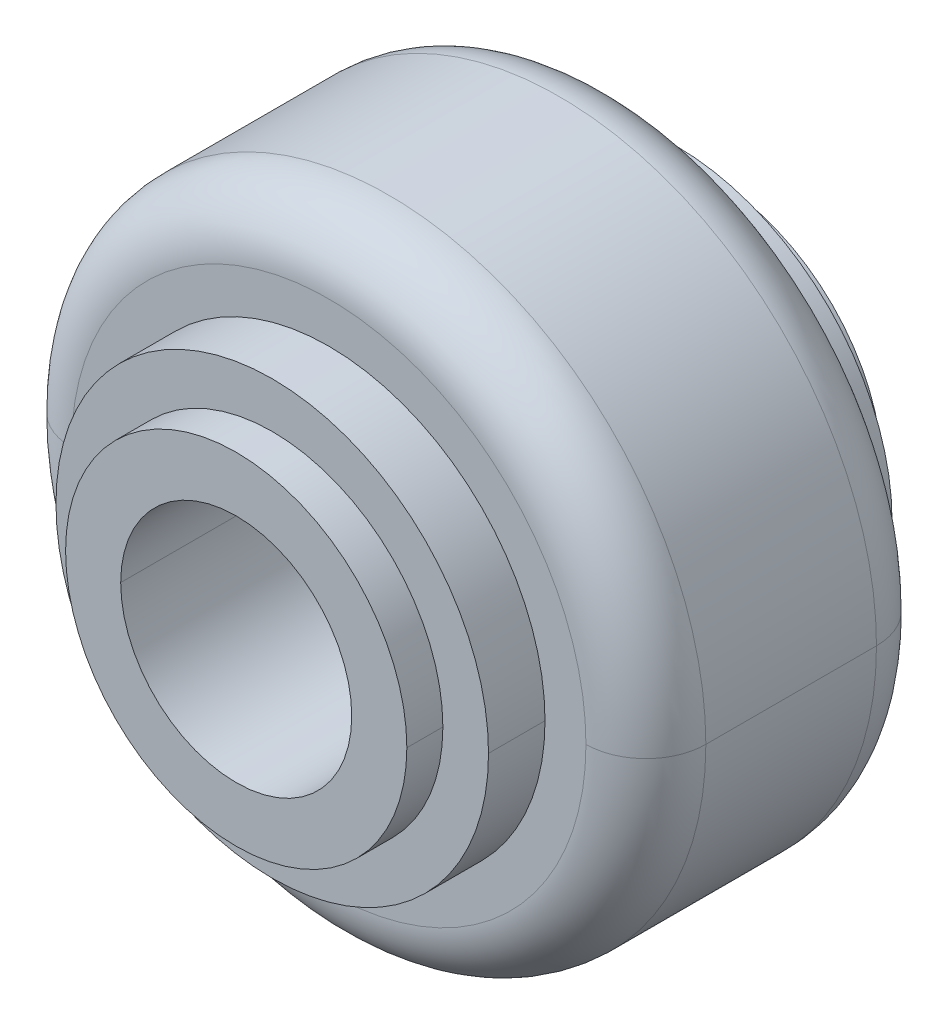
ISO-10303-21;
HEADER;
FILE_DESCRIPTION(('STEP AP214'),'2;1');
FILE_NAME('part.step','',(''),(''),'','','');
FILE_SCHEMA(('AUTOMOTIVE_DESIGN { 1 0 10303 214 1 1 1 1 }'));
ENDSEC;
DATA;
#1=APPLICATION_CONTEXT('core data for automotive mechanical design processes');
#2=APPLICATION_PROTOCOL_DEFINITION('international standard','automotive_design',2000,#1);
#3=PRODUCT_CONTEXT('',#1,'mechanical');
#4=PRODUCT('Part','Part','',(#3));
#5=PRODUCT_RELATED_PRODUCT_CATEGORY('part','',(#4));
#6=PRODUCT_DEFINITION_FORMATION('','',#4);
#7=PRODUCT_DEFINITION_CONTEXT('part definition',#1,'design');
#8=PRODUCT_DEFINITION('design','',#6,#7);
#9=PRODUCT_DEFINITION_SHAPE('','',#8);
#10=(LENGTH_UNIT() NAMED_UNIT(*) SI_UNIT(.MILLI.,.METRE.));
#11=(NAMED_UNIT(*) PLANE_ANGLE_UNIT() SI_UNIT($,.RADIAN.));
#12=(NAMED_UNIT(*) SI_UNIT($,.STERADIAN.) SOLID_ANGLE_UNIT());
#13=UNCERTAINTY_MEASURE_WITH_UNIT(LENGTH_MEASURE(1.E-05),#10,'distance_accuracy_value','');
#14=(GEOMETRIC_REPRESENTATION_CONTEXT(3) GLOBAL_UNCERTAINTY_ASSIGNED_CONTEXT((#13)) GLOBAL_UNIT_ASSIGNED_CONTEXT((#10,
#11,#12)) REPRESENTATION_CONTEXT('',''));
#15=CARTESIAN_POINT('',(0.,0.,0.));
#16=DIRECTION('',(0.,0.,1.));
#17=DIRECTION('',(1.,0.,0.));
#18=AXIS2_PLACEMENT_3D('',#15,#16,#17);
#19=CARTESIAN_POINT('',(0.,9.398,-13.096875));
#20=DIRECTION('',(0.,0.,1.));
#21=DIRECTION('',(1.,0.,0.));
#22=AXIS2_PLACEMENT_3D('',#19,#20,#21);
#23=PLANE('',#22);
#24=CARTESIAN_POINT('',(0.,0.,-13.096875));
#25=DIRECTION('',(0.,0.,-1.));
#26=DIRECTION('',(-1.,0.,0.));
#27=AXIS2_PLACEMENT_3D('',#24,#25,#26);
#28=CIRCLE('',#27,6.3627);
#29=CARTESIAN_POINT('',(-6.3627,0.,-13.096875));
#30=VERTEX_POINT('',#29);
#31=CARTESIAN_POINT('',(6.3627,0.,-13.096875));
#32=VERTEX_POINT('',#31);
#33=EDGE_CURVE('E11',#30,#32,#28,.T.);
#34=ORIENTED_EDGE('',*,*,#33,.F.);
#35=CARTESIAN_POINT('',(0.,0.,-13.096875));
#36=DIRECTION('',(0.,0.,-1.));
#37=DIRECTION('',(-1.,0.,0.));
#38=AXIS2_PLACEMENT_3D('',#35,#36,#37);
#39=CIRCLE('',#38,6.3627);
#40=EDGE_CURVE('E25',#32,#30,#39,.T.);
#41=ORIENTED_EDGE('',*,*,#40,.F.);
#42=EDGE_LOOP('',(#34,#41));
#43=FACE_BOUND('',#42,.T.);
#44=CARTESIAN_POINT('',(0.,0.,-13.096875));
#45=DIRECTION('',(0.,0.,-1.));
#46=DIRECTION('',(-1.,0.,0.));
#47=AXIS2_PLACEMENT_3D('',#44,#45,#46);
#48=CIRCLE('',#47,9.398);
#49=CARTESIAN_POINT('',(-9.398,0.,-13.096875));
#50=VERTEX_POINT('',#49);
#51=CARTESIAN_POINT('',(9.398,0.,-13.096875));
#52=VERTEX_POINT('',#51);
#53=EDGE_CURVE('E390',#50,#52,#48,.T.);
#54=ORIENTED_EDGE('',*,*,#53,.T.);
#55=CARTESIAN_POINT('',(0.,0.,-13.096875));
#56=DIRECTION('',(0.,0.,-1.));
#57=DIRECTION('',(-1.,0.,0.));
#58=AXIS2_PLACEMENT_3D('',#55,#56,#57);
#59=CIRCLE('',#58,9.398);
#60=EDGE_CURVE('E386',#52,#50,#59,.T.);
#61=ORIENTED_EDGE('',*,*,#60,.T.);
#62=EDGE_LOOP('',(#54,#61));
#63=FACE_BOUND('',#62,.T.);
#64=ADVANCED_FACE('F17',(#43,#63),#23,.F.);
#65=CARTESIAN_POINT('',(0.,0.,-13.096875));
#66=DIRECTION('',(0.,0.,1.));
#67=DIRECTION('',(0.,1.,0.));
#68=AXIS2_PLACEMENT_3D('',#65,#66,#67);
#69=CYLINDRICAL_SURFACE('',#68,9.398);
#70=CARTESIAN_POINT('',(0.,0.,-11.1125));
#71=DIRECTION('',(0.,0.,-1.));
#72=DIRECTION('',(-1.,0.,0.));
#73=AXIS2_PLACEMENT_3D('',#70,#71,#72);
#74=CIRCLE('',#73,9.398);
#75=CARTESIAN_POINT('',(9.398,0.,-11.1125));
#76=VERTEX_POINT('',#75);
#77=CARTESIAN_POINT('',(-9.398,0.,-11.1125));
#78=VERTEX_POINT('',#77);
#79=EDGE_CURVE('E382',#76,#78,#74,.T.);
#80=ORIENTED_EDGE('',*,*,#79,.T.);
#81=DIRECTION('',(0.,0.,1.));
#82=VECTOR('',#81,1.);
#83=CARTESIAN_POINT('',(-9.398,0.,-13.096875));
#84=LINE('',#83,#82);
#85=EDGE_CURVE('E377',#50,#78,#84,.T.);
#86=ORIENTED_EDGE('',*,*,#85,.F.);
#87=ORIENTED_EDGE('',*,*,#60,.F.);
#88=DIRECTION('',(0.,0.,1.));
#89=VECTOR('',#88,1.);
#90=CARTESIAN_POINT('',(9.398,0.,-13.096875));
#91=LINE('',#90,#89);
#92=EDGE_CURVE('E373',#52,#76,#91,.T.);
#93=ORIENTED_EDGE('',*,*,#92,.T.);
#94=EDGE_LOOP('',(#80,#86,#87,#93));
#95=FACE_BOUND('',#94,.T.);
#96=ADVANCED_FACE('F405',(#95),#69,.T.);
#97=CARTESIAN_POINT('',(0.,0.,-13.096875));
#98=DIRECTION('',(0.,0.,1.));
#99=DIRECTION('',(0.,-1.,0.));
#100=AXIS2_PLACEMENT_3D('',#97,#98,#99);
#101=CYLINDRICAL_SURFACE('',#100,9.398);
#102=ORIENTED_EDGE('',*,*,#53,.F.);
#103=ORIENTED_EDGE('',*,*,#85,.T.);
#104=CARTESIAN_POINT('',(0.,0.,-11.1125));
#105=DIRECTION('',(0.,0.,-1.));
#106=DIRECTION('',(-1.,0.,0.));
#107=AXIS2_PLACEMENT_3D('',#104,#105,#106);
#108=CIRCLE('',#107,9.398);
#109=EDGE_CURVE('E368',#78,#76,#108,.T.);
#110=ORIENTED_EDGE('',*,*,#109,.T.);
#111=ORIENTED_EDGE('',*,*,#92,.F.);
#112=EDGE_LOOP('',(#102,#103,#110,#111));
#113=FACE_BOUND('',#112,.T.);
#114=ADVANCED_FACE('F406',(#113),#101,.T.);
#115=CARTESIAN_POINT('',(0.,11.9126,-11.1125));
#116=DIRECTION('',(0.,0.,1.));
#117=DIRECTION('',(1.,0.,0.));
#118=AXIS2_PLACEMENT_3D('',#115,#116,#117);
#119=PLANE('',#118);
#120=ORIENTED_EDGE('',*,*,#109,.F.);
#121=ORIENTED_EDGE('',*,*,#79,.F.);
#122=EDGE_LOOP('',(#120,#121));
#123=FACE_BOUND('',#122,.T.);
#124=CARTESIAN_POINT('',(0.,0.,-11.1125));
#125=DIRECTION('',(0.,0.,-1.));
#126=DIRECTION('',(-1.,0.,0.));
#127=AXIS2_PLACEMENT_3D('',#124,#125,#126);
#128=CIRCLE('',#127,11.9126);
#129=CARTESIAN_POINT('',(-11.9126,0.,-11.1125));
#130=VERTEX_POINT('',#129);
#131=CARTESIAN_POINT('',(11.9126,0.,-11.1125));
#132=VERTEX_POINT('',#131);
#133=EDGE_CURVE('E364',#130,#132,#128,.T.);
#134=ORIENTED_EDGE('',*,*,#133,.T.);
#135=CARTESIAN_POINT('',(0.,0.,-11.1125));
#136=DIRECTION('',(0.,0.,-1.));
#137=DIRECTION('',(-1.,0.,0.));
#138=AXIS2_PLACEMENT_3D('',#135,#136,#137);
#139=CIRCLE('',#138,11.9126);
#140=EDGE_CURVE('E360',#132,#130,#139,.T.);
#141=ORIENTED_EDGE('',*,*,#140,.T.);
#142=EDGE_LOOP('',(#134,#141));
#143=FACE_BOUND('',#142,.T.);
#144=ADVANCED_FACE('F410',(#123,#143),#119,.F.);
#145=CARTESIAN_POINT('',(0.,0.,-13.096875));
#146=DIRECTION('',(0.,0.,1.));
#147=DIRECTION('',(0.,1.,0.));
#148=AXIS2_PLACEMENT_3D('',#145,#146,#147);
#149=CYLINDRICAL_SURFACE('',#148,11.9126);
#150=CARTESIAN_POINT('',(0.,0.,-8.001));
#151=DIRECTION('',(0.,0.,-1.));
#152=DIRECTION('',(-1.,0.,0.));
#153=AXIS2_PLACEMENT_3D('',#150,#151,#152);
#154=CIRCLE('',#153,11.9126);
#155=CARTESIAN_POINT('',(11.9126,0.,-8.001));
#156=VERTEX_POINT('',#155);
#157=CARTESIAN_POINT('',(-11.9126,0.,-8.001));
#158=VERTEX_POINT('',#157);
#159=EDGE_CURVE('E356',#156,#158,#154,.T.);
#160=ORIENTED_EDGE('',*,*,#159,.T.);
#161=DIRECTION('',(0.,0.,1.));
#162=VECTOR('',#161,1.);
#163=CARTESIAN_POINT('',(-11.9126,0.,-11.1125));
#164=LINE('',#163,#162);
#165=EDGE_CURVE('E351',#130,#158,#164,.T.);
#166=ORIENTED_EDGE('',*,*,#165,.F.);
#167=ORIENTED_EDGE('',*,*,#140,.F.);
#168=DIRECTION('',(0.,0.,1.));
#169=VECTOR('',#168,1.);
#170=CARTESIAN_POINT('',(11.9126,0.,-11.1125));
#171=LINE('',#170,#169);
#172=EDGE_CURVE('E347',#132,#156,#171,.T.);
#173=ORIENTED_EDGE('',*,*,#172,.T.);
#174=EDGE_LOOP('',(#160,#166,#167,#173));
#175=FACE_BOUND('',#174,.T.);
#176=ADVANCED_FACE('F413',(#175),#149,.T.);
#177=CARTESIAN_POINT('',(0.,0.,-13.096875));
#178=DIRECTION('',(0.,0.,1.));
#179=DIRECTION('',(0.,-1.,0.));
#180=AXIS2_PLACEMENT_3D('',#177,#178,#179);
#181=CYLINDRICAL_SURFACE('',#180,11.9126);
#182=ORIENTED_EDGE('',*,*,#133,.F.);
#183=ORIENTED_EDGE('',*,*,#165,.T.);
#184=CARTESIAN_POINT('',(0.,0.,-8.001));
#185=DIRECTION('',(0.,0.,-1.));
#186=DIRECTION('',(-1.,0.,0.));
#187=AXIS2_PLACEMENT_3D('',#184,#185,#186);
#188=CIRCLE('',#187,11.9126);
#189=EDGE_CURVE('E342',#158,#156,#188,.T.);
#190=ORIENTED_EDGE('',*,*,#189,.T.);
#191=ORIENTED_EDGE('',*,*,#172,.F.);
#192=EDGE_LOOP('',(#182,#183,#190,#191));
#193=FACE_BOUND('',#192,.T.);
#194=ADVANCED_FACE('F421',(#193),#181,.T.);
#195=CARTESIAN_POINT('',(0.,14.16685,-8.001));
#196=DIRECTION('',(0.,0.,1.));
#197=DIRECTION('',(1.,0.,0.));
#198=AXIS2_PLACEMENT_3D('',#195,#196,#197);
#199=PLANE('',#198);
#200=ORIENTED_EDGE('',*,*,#189,.F.);
#201=ORIENTED_EDGE('',*,*,#159,.F.);
#202=EDGE_LOOP('',(#200,#201));
#203=FACE_BOUND('',#202,.T.);
#204=CARTESIAN_POINT('',(0.,0.,-8.001));
#205=DIRECTION('',(0.,0.,-1.));
#206=DIRECTION('',(-1.,0.,0.));
#207=AXIS2_PLACEMENT_3D('',#204,#205,#206);
#208=CIRCLE('',#207,14.16685);
#209=CARTESIAN_POINT('',(-14.16685,0.,-8.001));
#210=VERTEX_POINT('',#209);
#211=CARTESIAN_POINT('',(14.16685,0.,-8.00100000000008));
#212=VERTEX_POINT('',#211);
#213=EDGE_CURVE('E338',#210,#212,#208,.T.);
#214=ORIENTED_EDGE('',*,*,#213,.T.);
#215=CARTESIAN_POINT('',(0.,0.,-8.001));
#216=DIRECTION('',(0.,0.,-1.));
#217=DIRECTION('',(-1.,0.,0.));
#218=AXIS2_PLACEMENT_3D('',#215,#216,#217);
#219=CIRCLE('',#218,14.16685);
#220=EDGE_CURVE('E334',#212,#210,#219,.T.);
#221=ORIENTED_EDGE('',*,*,#220,.T.);
#222=EDGE_LOOP('',(#214,#221));
#223=FACE_BOUND('',#222,.T.);
#224=ADVANCED_FACE('F425',(#203,#223),#199,.F.);
#225=CARTESIAN_POINT('',(0.,0.,-4.69900000000008));
#226=DIRECTION('',(0.,0.,-1.));
#227=DIRECTION('',(0.,1.,0.));
#228=AXIS2_PLACEMENT_3D('',#225,#226,#227);
#229=TOROIDAL_SURFACE('',#228,14.16685,3.302);
#230=CARTESIAN_POINT('',(0.,0.,-4.699));
#231=DIRECTION('',(0.,0.,-1.));
#232=DIRECTION('',(-1.,0.,0.));
#233=AXIS2_PLACEMENT_3D('',#230,#231,#232);
#234=CIRCLE('',#233,17.46885);
#235=CARTESIAN_POINT('',(17.46885,0.,-4.69900000000008));
#236=VERTEX_POINT('',#235);
#237=CARTESIAN_POINT('',(-17.46885,0.,-4.699));
#238=VERTEX_POINT('',#237);
#239=EDGE_CURVE('E332',#236,#238,#234,.T.);
#240=ORIENTED_EDGE('',*,*,#239,.T.);
#241=CARTESIAN_POINT('',(-17.46885,0.,-4.69900000000008));
#242=CARTESIAN_POINT('',(-17.4688511460871,0.,-4.75302890321754));
#243=CARTESIAN_POINT('',(-17.4675239733473,0.,-4.80705770891421));
#244=CARTESIAN_POINT('',(-17.4622212194317,0.,-4.91498521234421));
#245=CARTESIAN_POINT('',(-17.458245638256,0.,-4.96888391007753));
#246=CARTESIAN_POINT('',(-17.4476542966872,0.,-5.07642128465904));
#247=CARTESIAN_POINT('',(-17.4410385362939,0.,-5.13005996150722));
#248=CARTESIAN_POINT('',(-17.4251831355135,0.,-5.23694809179614));
#249=CARTESIAN_POINT('',(-17.4159434951262,0.,-5.29019754523688));
#250=CARTESIAN_POINT('',(-17.3948624966567,0.,-5.39617894135779));
#251=CARTESIAN_POINT('',(-17.3830211385745,0.,-5.44891088403796));
#252=CARTESIAN_POINT('',(-17.3567652575223,0.,-5.55373022404334));
#253=CARTESIAN_POINT('',(-17.3423507345524,0.,-5.60581762136855));
#254=CARTESIAN_POINT('',(-17.3109832426231,0.,-5.70922238722007));
#255=CARTESIAN_POINT('',(-17.2940302736637,0.,-5.76053975574639));
#256=CARTESIAN_POINT('',(-17.2576267328049,0.,-5.86228083605598));
#257=CARTESIAN_POINT('',(-17.2381761609055,0.,-5.91270454783925));
#258=CARTESIAN_POINT('',(-17.196824271799,0.,-6.01253683949995));
#259=CARTESIAN_POINT('',(-17.1749229545919,0.,-6.06194541937738));
#260=CARTESIAN_POINT('',(-17.1287223371953,0.,-6.15962841763635));
#261=CARTESIAN_POINT('',(-17.1044230370057,0.,-6.2079028360179));
#262=CARTESIAN_POINT('',(-17.0534849927508,0.,-6.30320121398114));
#263=CARTESIAN_POINT('',(-17.0268462486855,0.,-6.35022517356282));
#264=CARTESIAN_POINT('',(-16.9712934917563,0.,-6.44290934908936));
#265=CARTESIAN_POINT('',(-16.9423794788925,0.,-6.48856956503422));
#266=CARTESIAN_POINT('',(-16.8823458407535,0.,-6.57841625382739));
#267=CARTESIAN_POINT('',(-16.8512262154782,0.,-6.62260272667571));
#268=CARTESIAN_POINT('',(-16.78685632242,0.,-6.70939548019247));
#269=CARTESIAN_POINT('',(-16.753606054637,0.,-6.75200176086092));
#270=CARTESIAN_POINT('',(-16.6850549793705,0.,-6.83553148775594));
#271=CARTESIAN_POINT('',(-16.6497541718871,0.,-6.87645493398251));
#272=CARTESIAN_POINT('',(-16.577187059957,0.,-6.95652040382735));
#273=CARTESIAN_POINT('',(-16.5399207555104,0.,-6.99566242744561));
#274=CARTESIAN_POINT('',(-16.4635124274455,0.,-7.0720707555105));
#275=CARTESIAN_POINT('',(-16.4243704038273,0.,-7.10933705995712));
#276=CARTESIAN_POINT('',(-16.3443049339824,0.,-7.18190417188718));
#277=CARTESIAN_POINT('',(-16.3033814877559,0.,-7.21720497937062));
#278=CARTESIAN_POINT('',(-16.2198517608609,0.,-7.28575605463705));
#279=CARTESIAN_POINT('',(-16.1772454801924,0.,-7.31900632242004));
#280=CARTESIAN_POINT('',(-16.0904527266756,0.,-7.38337621547829));
#281=CARTESIAN_POINT('',(-16.0462662538273,0.,-7.41449584075355));
#282=CARTESIAN_POINT('',(-15.9564195650341,0.,-7.47452947889261));
#283=CARTESIAN_POINT('',(-15.9107593490893,0.,-7.5034434917564));
#284=CARTESIAN_POINT('',(-15.8180751735628,0.,-7.55899624868554));
#285=CARTESIAN_POINT('',(-15.7710512139811,0.,-7.58563499275089));
#286=CARTESIAN_POINT('',(-15.6757528360178,0.,-7.6365730370058));
#287=CARTESIAN_POINT('',(-15.6274784176363,0.,-7.66087233719536));
#288=CARTESIAN_POINT('',(-15.5297954193773,0.,-7.70707295459201));
#289=CARTESIAN_POINT('',(-15.4803868394999,0.,-7.72897427179909));
#290=CARTESIAN_POINT('',(-15.3805545478392,0.,-7.77032616090559));
#291=CARTESIAN_POINT('',(-15.3301308360559,0.,-7.78977673280501));
#292=CARTESIAN_POINT('',(-15.2283897557463,0.,-7.82618027366381));
#293=CARTESIAN_POINT('',(-15.17707238722,0.,-7.84313324262319));
#294=CARTESIAN_POINT('',(-15.0736676213685,0.,-7.87450073455247));
#295=CARTESIAN_POINT('',(-15.0215802240433,0.,-7.88891525752238));
#296=CARTESIAN_POINT('',(-14.9167608840379,0.,-7.91517113857454));
#297=CARTESIAN_POINT('',(-14.8640289413577,0.,-7.92701249665679));
#298=CARTESIAN_POINT('',(-14.7580475452368,0.,-7.9480934951263));
#299=CARTESIAN_POINT('',(-14.7047980917961,0.,-7.95733313551355));
#300=CARTESIAN_POINT('',(-14.5979099615071,0.,-7.97318853629401));
#301=CARTESIAN_POINT('',(-14.544271284659,0.,-7.97980429668723));
#302=CARTESIAN_POINT('',(-14.4367339100775,0.,-7.99039563825611));
#303=CARTESIAN_POINT('',(-14.3828352123441,0.,-7.99437121943178));
#304=CARTESIAN_POINT('',(-14.2749077089141,0.,-7.99967397334733));
#305=CARTESIAN_POINT('',(-14.2208789032175,0.,-8.00100114608721));
#306=CARTESIAN_POINT('',(-14.16685,0.,-8.00100000000008));
#307=B_SPLINE_CURVE_WITH_KNOTS('',3,(#241,#242,#243,#244,#245,#246,#247,#248,#249,#250,#251,
#252,#253,#254,#255,#256,#257,#258,#259,#260,#261,#262,#263,#264,#265,#266,#267,#268,#269,#270,
#271,#272,#273,#274,#275,#276,#277,#278,#279,#280,#281,#282,#283,#284,#285,#286,#287,#288,#289,
#290,#291,#292,#293,#294,#295,#296,#297,#298,#299,#300,#301,#302,#303,#304,#305,#306),
.UNSPECIFIED.,.F.,.F.,(4,2,2,2,2,2,2,2,2,2,2,2,2,2,2,2,2,2,2,2,2,2,2,2,2,2,2,2,2,2,2,2,4),(0.,
0.162070273165312,0.324140546330625,0.486210819495938,0.64828109266125,0.810351365826563,
0.972421638991876,1.13449191215719,1.2965621853225,1.45863245848781,1.62070273165313,
1.78277300481844,1.94484327798375,2.10691355114906,2.26898382431438,2.43105409747969,
2.593124370645,2.75519464381031,2.91726491697563,3.07933519014094,3.24140546330625,
3.40347573647156,3.56554600963688,3.72761628280219,3.8896865559675,4.05175682913281,
4.21382710229813,4.37589737546344,4.53796764862875,4.70003792179406,4.86210819495938,
5.02417846812469,5.18624874129),.UNSPECIFIED.);
#308=EDGE_CURVE('E309',#238,#210,#307,.T.);
#309=ORIENTED_EDGE('',*,*,#308,.T.);
#310=ORIENTED_EDGE('',*,*,#220,.F.);
#311=CARTESIAN_POINT('',(17.46885,0.,-4.69900000000008));
#312=CARTESIAN_POINT('',(17.4688511460871,0.,-4.75302890321754));
#313=CARTESIAN_POINT('',(17.4675239733473,0.,-4.80705770891421));
#314=CARTESIAN_POINT('',(17.4622212194317,0.,-4.91498521234421));
#315=CARTESIAN_POINT('',(17.458245638256,0.,-4.96888391007754));
#316=CARTESIAN_POINT('',(17.4476542966872,0.,-5.07642128465904));
#317=CARTESIAN_POINT('',(17.4410385362939,0.,-5.13005996150722));
#318=CARTESIAN_POINT('',(17.4251831355135,0.,-5.23694809179614));
#319=CARTESIAN_POINT('',(17.4159434951262,0.,-5.29019754523688));
#320=CARTESIAN_POINT('',(17.3948624966567,0.,-5.39617894135779));
#321=CARTESIAN_POINT('',(17.3830211385745,0.,-5.44891088403797));
#322=CARTESIAN_POINT('',(17.3567652575223,0.,-5.55373022404335));
#323=CARTESIAN_POINT('',(17.3423507345524,0.,-5.60581762136855));
#324=CARTESIAN_POINT('',(17.3109832426231,0.,-5.70922238722008));
#325=CARTESIAN_POINT('',(17.2940302736637,0.,-5.76053975574639));
#326=CARTESIAN_POINT('',(17.2576267328049,0.,-5.86228083605598));
#327=CARTESIAN_POINT('',(17.2381761609055,0.,-5.91270454783926));
#328=CARTESIAN_POINT('',(17.196824271799,0.,-6.01253683949995));
#329=CARTESIAN_POINT('',(17.1749229545919,0.,-6.06194541937738));
#330=CARTESIAN_POINT('',(17.1287223371953,0.,-6.15962841763636));
#331=CARTESIAN_POINT('',(17.1044230370057,0.,-6.2079028360179));
#332=CARTESIAN_POINT('',(17.0534849927508,0.,-6.30320121398114));
#333=CARTESIAN_POINT('',(17.0268462486855,0.,-6.35022517356283));
#334=CARTESIAN_POINT('',(16.9712934917563,0.,-6.44290934908937));
#335=CARTESIAN_POINT('',(16.9423794788925,0.,-6.48856956503422));
#336=CARTESIAN_POINT('',(16.8823458407535,0.,-6.57841625382739));
#337=CARTESIAN_POINT('',(16.8512262154782,0.,-6.62260272667571));
#338=CARTESIAN_POINT('',(16.78685632242,0.,-6.70939548019248));
#339=CARTESIAN_POINT('',(16.753606054637,0.,-6.75200176086093));
#340=CARTESIAN_POINT('',(16.6850549793705,0.,-6.83553148775594));
#341=CARTESIAN_POINT('',(16.6497541718871,0.,-6.87645493398251));
#342=CARTESIAN_POINT('',(16.577187059957,0.,-6.95652040382735));
#343=CARTESIAN_POINT('',(16.5399207555104,0.,-6.99566242744561));
#344=CARTESIAN_POINT('',(16.4635124274455,0.,-7.0720707555105));
#345=CARTESIAN_POINT('',(16.4243704038273,0.,-7.10933705995712));
#346=CARTESIAN_POINT('',(16.3443049339824,0.,-7.18190417188718));
#347=CARTESIAN_POINT('',(16.3033814877559,0.,-7.21720497937062));
#348=CARTESIAN_POINT('',(16.2198517608608,0.,-7.28575605463705));
#349=CARTESIAN_POINT('',(16.1772454801924,0.,-7.31900632242004));
#350=CARTESIAN_POINT('',(16.0904527266756,0.,-7.38337621547829));
#351=CARTESIAN_POINT('',(16.0462662538273,0.,-7.41449584075355));
#352=CARTESIAN_POINT('',(15.9564195650341,0.,-7.47452947889261));
#353=CARTESIAN_POINT('',(15.9107593490893,0.,-7.5034434917564));
#354=CARTESIAN_POINT('',(15.8180751735627,0.,-7.55899624868554));
#355=CARTESIAN_POINT('',(15.7710512139811,0.,-7.58563499275089));
#356=CARTESIAN_POINT('',(15.6757528360178,0.,-7.6365730370058));
#357=CARTESIAN_POINT('',(15.6274784176363,0.,-7.66087233719536));
#358=CARTESIAN_POINT('',(15.5297954193773,0.,-7.70707295459201));
#359=CARTESIAN_POINT('',(15.4803868394999,0.,-7.72897427179909));
#360=CARTESIAN_POINT('',(15.3805545478392,0.,-7.7703261609056));
#361=CARTESIAN_POINT('',(15.3301308360559,0.,-7.78977673280501));
#362=CARTESIAN_POINT('',(15.2283897557463,0.,-7.82618027366381));
#363=CARTESIAN_POINT('',(15.17707238722,0.,-7.84313324262319));
#364=CARTESIAN_POINT('',(15.0736676213685,0.,-7.87450073455247));
#365=CARTESIAN_POINT('',(15.0215802240433,0.,-7.88891525752238));
#366=CARTESIAN_POINT('',(14.9167608840379,0.,-7.91517113857454));
#367=CARTESIAN_POINT('',(14.8640289413577,0.,-7.92701249665679));
#368=CARTESIAN_POINT('',(14.7580475452368,0.,-7.9480934951263));
#369=CARTESIAN_POINT('',(14.7047980917961,0.,-7.95733313551355));
#370=CARTESIAN_POINT('',(14.5979099615071,0.,-7.97318853629402));
#371=CARTESIAN_POINT('',(14.544271284659,0.,-7.97980429668723));
#372=CARTESIAN_POINT('',(14.4367339100775,0.,-7.99039563825611));
#373=CARTESIAN_POINT('',(14.3828352123441,0.,-7.99437121943178));
#374=CARTESIAN_POINT('',(14.2749077089141,0.,-7.99967397334733));
#375=CARTESIAN_POINT('',(14.2208789032175,0.,-8.00100114608721));
#376=CARTESIAN_POINT('',(14.16685,0.,-8.00100000000008));
#377=B_SPLINE_CURVE_WITH_KNOTS('',3,(#311,#312,#313,#314,#315,#316,#317,#318,#319,#320,#321,
#322,#323,#324,#325,#326,#327,#328,#329,#330,#331,#332,#333,#334,#335,#336,#337,#338,#339,#340,
#341,#342,#343,#344,#345,#346,#347,#348,#349,#350,#351,#352,#353,#354,#355,#356,#357,#358,#359,
#360,#361,#362,#363,#364,#365,#366,#367,#368,#369,#370,#371,#372,#373,#374,#375,#376),
.UNSPECIFIED.,.F.,.F.,(4,2,2,2,2,2,2,2,2,2,2,2,2,2,2,2,2,2,2,2,2,2,2,2,2,2,2,2,2,2,2,2,4),(0.,
0.162070273165313,0.324140546330626,0.486210819495938,0.64828109266125,0.810351365826564,
0.972421638991876,1.13449191215719,1.2965621853225,1.45863245848781,1.62070273165313,
1.78277300481844,1.94484327798375,2.10691355114906,2.26898382431438,2.43105409747969,
2.593124370645,2.75519464381031,2.91726491697563,3.07933519014094,3.24140546330625,
3.40347573647156,3.56554600963688,3.72761628280219,3.8896865559675,4.05175682913282,
4.21382710229813,4.37589737546344,4.53796764862875,4.70003792179407,4.86210819495938,
5.02417846812469,5.18624874129),.UNSPECIFIED.);
#378=EDGE_CURVE('E322',#236,#212,#377,.T.);
#379=ORIENTED_EDGE('',*,*,#378,.F.);
#380=EDGE_LOOP('',(#240,#309,#310,#379));
#381=FACE_BOUND('',#380,.T.);
#382=ADVANCED_FACE('F288',(#381),#229,.T.);
#383=CARTESIAN_POINT('',(0.,0.,-4.69900000000008));
#384=DIRECTION('',(0.,0.,-1.));
#385=DIRECTION('',(0.,-1.,0.));
#386=AXIS2_PLACEMENT_3D('',#383,#384,#385);
#387=TOROIDAL_SURFACE('',#386,14.16685,3.302);
#388=ORIENTED_EDGE('',*,*,#213,.F.);
#389=ORIENTED_EDGE('',*,*,#308,.F.);
#390=CARTESIAN_POINT('',(0.,0.,-4.699));
#391=DIRECTION('',(0.,0.,-1.));
#392=DIRECTION('',(-1.,0.,0.));
#393=AXIS2_PLACEMENT_3D('',#390,#391,#392);
#394=CIRCLE('',#393,17.46885);
#395=EDGE_CURVE('E268',#238,#236,#394,.T.);
#396=ORIENTED_EDGE('',*,*,#395,.T.);
#397=ORIENTED_EDGE('',*,*,#378,.T.);
#398=EDGE_LOOP('',(#388,#389,#396,#397));
#399=FACE_BOUND('',#398,.T.);
#400=ADVANCED_FACE('F277',(#399),#387,.T.);
#401=CARTESIAN_POINT('',(0.,0.,-13.096875));
#402=DIRECTION('',(0.,0.,1.));
#403=DIRECTION('',(0.,-1.,0.));
#404=AXIS2_PLACEMENT_3D('',#401,#402,#403);
#405=CYLINDRICAL_SURFACE('',#404,17.46885);
#406=ORIENTED_EDGE('',*,*,#395,.F.);
#407=DIRECTION('',(0.,0.,1.));
#408=VECTOR('',#407,1.);
#409=CARTESIAN_POINT('',(-17.46885,0.,-4.699));
#410=LINE('',#409,#408);
#411=CARTESIAN_POINT('',(-17.46885,0.,4.699));
#412=VERTEX_POINT('',#411);
#413=EDGE_CURVE('E264',#238,#412,#410,.T.);
#414=ORIENTED_EDGE('',*,*,#413,.T.);
#415=CARTESIAN_POINT('',(0.,0.,4.699));
#416=DIRECTION('',(0.,0.,-1.));
#417=DIRECTION('',(-1.,0.,0.));
#418=AXIS2_PLACEMENT_3D('',#415,#416,#417);
#419=CIRCLE('',#418,17.46885);
#420=CARTESIAN_POINT('',(17.46885,0.,4.699));
#421=VERTEX_POINT('',#420);
#422=EDGE_CURVE('E260',#412,#421,#419,.T.);
#423=ORIENTED_EDGE('',*,*,#422,.T.);
#424=DIRECTION('',(0.,0.,1.));
#425=VECTOR('',#424,1.);
#426=CARTESIAN_POINT('',(17.46885,0.,-4.699));
#427=LINE('',#426,#425);
#428=EDGE_CURVE('E255',#236,#421,#427,.T.);
#429=ORIENTED_EDGE('',*,*,#428,.F.);
#430=EDGE_LOOP('',(#406,#414,#423,#429));
#431=FACE_BOUND('',#430,.T.);
#432=ADVANCED_FACE('F287',(#431),#405,.T.);
#433=CARTESIAN_POINT('',(0.,0.,-13.096875));
#434=DIRECTION('',(0.,0.,1.));
#435=DIRECTION('',(0.,1.,0.));
#436=AXIS2_PLACEMENT_3D('',#433,#434,#435);
#437=CYLINDRICAL_SURFACE('',#436,17.46885);
#438=CARTESIAN_POINT('',(0.,0.,4.699));
#439=DIRECTION('',(0.,0.,-1.));
#440=DIRECTION('',(-1.,0.,0.));
#441=AXIS2_PLACEMENT_3D('',#438,#439,#440);
#442=CIRCLE('',#441,17.46885);
#443=EDGE_CURVE('E250',#421,#412,#442,.T.);
#444=ORIENTED_EDGE('',*,*,#443,.T.);
#445=ORIENTED_EDGE('',*,*,#413,.F.);
#446=ORIENTED_EDGE('',*,*,#239,.F.);
#447=ORIENTED_EDGE('',*,*,#428,.T.);
#448=EDGE_LOOP('',(#444,#445,#446,#447));
#449=FACE_BOUND('',#448,.T.);
#450=ADVANCED_FACE('F433',(#449),#437,.T.);
#451=CARTESIAN_POINT('',(0.,0.,4.69900000000008));
#452=DIRECTION('',(0.,0.,-1.));
#453=DIRECTION('',(0.,1.,0.));
#454=AXIS2_PLACEMENT_3D('',#451,#452,#453);
#455=TOROIDAL_SURFACE('',#454,14.16685,3.302);
#456=CARTESIAN_POINT('',(0.,0.,8.001));
#457=DIRECTION('',(0.,0.,-1.));
#458=DIRECTION('',(-1.,0.,0.));
#459=AXIS2_PLACEMENT_3D('',#456,#457,#458);
#460=CIRCLE('',#459,14.16685);
#461=CARTESIAN_POINT('',(14.16685,0.,8.00100000000008));
#462=VERTEX_POINT('',#461);
#463=CARTESIAN_POINT('',(-14.16685,0.,8.001));
#464=VERTEX_POINT('',#463);
#465=EDGE_CURVE('E248',#462,#464,#460,.T.);
#466=ORIENTED_EDGE('',*,*,#465,.T.);
#467=CARTESIAN_POINT('',(-14.16685,0.,8.00100000000008));
#468=CARTESIAN_POINT('',(-14.2208789032174,0.,8.00100114608721));
#469=CARTESIAN_POINT('',(-14.2749077089141,0.,7.99967397334733));
#470=CARTESIAN_POINT('',(-14.3828352123441,0.,7.99437121943178));
#471=CARTESIAN_POINT('',(-14.4367339100774,0.,7.99039563825611));
#472=CARTESIAN_POINT('',(-14.5442712846589,0.,7.97980429668723));
#473=CARTESIAN_POINT('',(-14.5979099615071,0.,7.97318853629402));
#474=CARTESIAN_POINT('',(-14.7047980917961,0.,7.95733313551355));
#475=CARTESIAN_POINT('',(-14.7580475452368,0.,7.9480934951263));
#476=CARTESIAN_POINT('',(-14.8640289413577,0.,7.92701249665679));
#477=CARTESIAN_POINT('',(-14.9167608840379,0.,7.91517113857454));
#478=CARTESIAN_POINT('',(-15.0215802240433,0.,7.88891525752239));
#479=CARTESIAN_POINT('',(-15.0736676213685,0.,7.87450073455248));
#480=CARTESIAN_POINT('',(-15.17707238722,0.,7.84313324262319));
#481=CARTESIAN_POINT('',(-15.2283897557463,0.,7.82618027366381));
#482=CARTESIAN_POINT('',(-15.3301308360559,0.,7.78977673280502));
#483=CARTESIAN_POINT('',(-15.3805545478392,0.,7.7703261609056));
#484=CARTESIAN_POINT('',(-15.4803868394999,0.,7.7289742717991));
#485=CARTESIAN_POINT('',(-15.5297954193773,0.,7.70707295459202));
#486=CARTESIAN_POINT('',(-15.6274784176363,0.,7.66087233719537));
#487=CARTESIAN_POINT('',(-15.6757528360178,0.,7.6365730370058));
#488=CARTESIAN_POINT('',(-15.771051213981,0.,7.5856349927509));
#489=CARTESIAN_POINT('',(-15.8180751735627,0.,7.55899624868555));
#490=CARTESIAN_POINT('',(-15.9107593490893,0.,7.50344349175641));
#491=CARTESIAN_POINT('',(-15.9564195650341,0.,7.47452947889262));
#492=CARTESIAN_POINT('',(-16.0462662538273,0.,7.41449584075356));
#493=CARTESIAN_POINT('',(-16.0904527266756,0.,7.3833762154783));
#494=CARTESIAN_POINT('',(-16.1772454801924,0.,7.31900632242005));
#495=CARTESIAN_POINT('',(-16.2198517608608,0.,7.28575605463706));
#496=CARTESIAN_POINT('',(-16.3033814877559,0.,7.21720497937063));
#497=CARTESIAN_POINT('',(-16.3443049339824,0.,7.18190417188719));
#498=CARTESIAN_POINT('',(-16.4243704038273,0.,7.10933705995713));
#499=CARTESIAN_POINT('',(-16.4635124274455,0.,7.07207075551051));
#500=CARTESIAN_POINT('',(-16.5399207555104,0.,6.99566242744562));
#501=CARTESIAN_POINT('',(-16.577187059957,0.,6.95652040382736));
#502=CARTESIAN_POINT('',(-16.6497541718871,0.,6.87645493398252));
#503=CARTESIAN_POINT('',(-16.6850549793705,0.,6.83553148775595));
#504=CARTESIAN_POINT('',(-16.753606054637,0.,6.75200176086094));
#505=CARTESIAN_POINT('',(-16.78685632242,0.,6.70939548019249));
#506=CARTESIAN_POINT('',(-16.8512262154782,0.,6.62260272667572));
#507=CARTESIAN_POINT('',(-16.8823458407535,0.,6.5784162538274));
#508=CARTESIAN_POINT('',(-16.9423794788925,0.,6.48856956503423));
#509=CARTESIAN_POINT('',(-16.9712934917563,0.,6.44290934908938));
#510=CARTESIAN_POINT('',(-17.0268462486855,0.,6.35022517356284));
#511=CARTESIAN_POINT('',(-17.0534849927508,0.,6.30320121398115));
#512=CARTESIAN_POINT('',(-17.1044230370057,0.,6.20790283601792));
#513=CARTESIAN_POINT('',(-17.1287223371953,0.,6.15962841763637));
#514=CARTESIAN_POINT('',(-17.1749229545919,0.,6.06194541937739));
#515=CARTESIAN_POINT('',(-17.196824271799,0.,6.01253683949996));
#516=CARTESIAN_POINT('',(-17.2381761609055,0.,5.91270454783927));
#517=CARTESIAN_POINT('',(-17.2576267328049,0.,5.862280836056));
#518=CARTESIAN_POINT('',(-17.2940302736637,0.,5.76053975574641));
#519=CARTESIAN_POINT('',(-17.3109832426231,0.,5.70922238722009));
#520=CARTESIAN_POINT('',(-17.3423507345524,0.,5.60581762136856));
#521=CARTESIAN_POINT('',(-17.3567652575223,0.,5.55373022404336));
#522=CARTESIAN_POINT('',(-17.3830211385745,0.,5.44891088403798));
#523=CARTESIAN_POINT('',(-17.3948624966567,0.,5.3961789413578));
#524=CARTESIAN_POINT('',(-17.4159434951262,0.,5.29019754523689));
#525=CARTESIAN_POINT('',(-17.4251831355135,0.,5.23694809179615));
#526=CARTESIAN_POINT('',(-17.4410385362939,0.,5.13005996150724));
#527=CARTESIAN_POINT('',(-17.4476542966872,0.,5.07642128465905));
#528=CARTESIAN_POINT('',(-17.458245638256,0.,4.96888391007755));
#529=CARTESIAN_POINT('',(-17.4622212194317,0.,4.91498521234422));
#530=CARTESIAN_POINT('',(-17.4675239733473,0.,4.80705770891423));
#531=CARTESIAN_POINT('',(-17.4688511460871,0.,4.75302890321755));
#532=CARTESIAN_POINT('',(-17.46885,0.,4.69900000000009));
#533=B_SPLINE_CURVE_WITH_KNOTS('',3,(#467,#468,#469,#470,#471,#472,#473,#474,#475,#476,#477,
#478,#479,#480,#481,#482,#483,#484,#485,#486,#487,#488,#489,#490,#491,#492,#493,#494,#495,#496,
#497,#498,#499,#500,#501,#502,#503,#504,#505,#506,#507,#508,#509,#510,#511,#512,#513,#514,#515,
#516,#517,#518,#519,#520,#521,#522,#523,#524,#525,#526,#527,#528,#529,#530,#531,#532),
.UNSPECIFIED.,.F.,.F.,(4,2,2,2,2,2,2,2,2,2,2,2,2,2,2,2,2,2,2,2,2,2,2,2,2,2,2,2,2,2,2,2,4),(0.,
0.162070273165312,0.324140546330624,0.486210819495938,0.64828109266125,0.810351365826562,
0.972421638991875,1.13449191215719,1.2965621853225,1.45863245848781,1.62070273165312,
1.78277300481844,1.94484327798375,2.10691355114906,2.26898382431438,2.43105409747969,
2.593124370645,2.75519464381031,2.91726491697563,3.07933519014094,3.24140546330625,
3.40347573647156,3.56554600963688,3.72761628280219,3.8896865559675,4.05175682913282,
4.21382710229813,4.37589737546344,4.53796764862875,4.70003792179407,4.86210819495938,
5.02417846812469,5.18624874129),.UNSPECIFIED.);
#534=EDGE_CURVE('E225',#464,#412,#533,.T.);
#535=ORIENTED_EDGE('',*,*,#534,.T.);
#536=ORIENTED_EDGE('',*,*,#443,.F.);
#537=CARTESIAN_POINT('',(14.16685,0.,8.00100000000008));
#538=CARTESIAN_POINT('',(14.2208789032174,0.,8.00100114608721));
#539=CARTESIAN_POINT('',(14.2749077089141,0.,7.99967397334733));
#540=CARTESIAN_POINT('',(14.3828352123441,0.,7.99437121943178));
#541=CARTESIAN_POINT('',(14.4367339100774,0.,7.99039563825611));
#542=CARTESIAN_POINT('',(14.544271284659,0.,7.97980429668723));
#543=CARTESIAN_POINT('',(14.5979099615071,0.,7.97318853629402));
#544=CARTESIAN_POINT('',(14.7047980917961,0.,7.95733313551355));
#545=CARTESIAN_POINT('',(14.7580475452368,0.,7.9480934951263));
#546=CARTESIAN_POINT('',(14.8640289413577,0.,7.92701249665679));
#547=CARTESIAN_POINT('',(14.9167608840379,0.,7.91517113857454));
#548=CARTESIAN_POINT('',(15.0215802240433,0.,7.88891525752239));
#549=CARTESIAN_POINT('',(15.0736676213685,0.,7.87450073455248));
#550=CARTESIAN_POINT('',(15.17707238722,0.,7.84313324262319));
#551=CARTESIAN_POINT('',(15.2283897557463,0.,7.82618027366381));
#552=CARTESIAN_POINT('',(15.3301308360559,0.,7.78977673280502));
#553=CARTESIAN_POINT('',(15.3805545478392,0.,7.7703261609056));
#554=CARTESIAN_POINT('',(15.4803868394999,0.,7.7289742717991));
#555=CARTESIAN_POINT('',(15.5297954193773,0.,7.70707295459201));
#556=CARTESIAN_POINT('',(15.6274784176363,0.,7.66087233719537));
#557=CARTESIAN_POINT('',(15.6757528360178,0.,7.6365730370058));
#558=CARTESIAN_POINT('',(15.7710512139811,0.,7.5856349927509));
#559=CARTESIAN_POINT('',(15.8180751735627,0.,7.55899624868555));
#560=CARTESIAN_POINT('',(15.9107593490893,0.,7.50344349175641));
#561=CARTESIAN_POINT('',(15.9564195650341,0.,7.47452947889261));
#562=CARTESIAN_POINT('',(16.0462662538273,0.,7.41449584075356));
#563=CARTESIAN_POINT('',(16.0904527266756,0.,7.3833762154783));
#564=CARTESIAN_POINT('',(16.1772454801924,0.,7.31900632242005));
#565=CARTESIAN_POINT('',(16.2198517608608,0.,7.28575605463705));
#566=CARTESIAN_POINT('',(16.3033814877559,0.,7.21720497937063));
#567=CARTESIAN_POINT('',(16.3443049339824,0.,7.18190417188719));
#568=CARTESIAN_POINT('',(16.4243704038273,0.,7.10933705995713));
#569=CARTESIAN_POINT('',(16.4635124274455,0.,7.07207075551051));
#570=CARTESIAN_POINT('',(16.5399207555104,0.,6.99566242744562));
#571=CARTESIAN_POINT('',(16.577187059957,0.,6.95652040382736));
#572=CARTESIAN_POINT('',(16.6497541718871,0.,6.87645493398252));
#573=CARTESIAN_POINT('',(16.6850549793705,0.,6.83553148775595));
#574=CARTESIAN_POINT('',(16.753606054637,0.,6.75200176086093));
#575=CARTESIAN_POINT('',(16.78685632242,0.,6.70939548019248));
#576=CARTESIAN_POINT('',(16.8512262154782,0.,6.62260272667572));
#577=CARTESIAN_POINT('',(16.8823458407535,0.,6.5784162538274));
#578=CARTESIAN_POINT('',(16.9423794788925,0.,6.48856956503423));
#579=CARTESIAN_POINT('',(16.9712934917563,0.,6.44290934908937));
#580=CARTESIAN_POINT('',(17.0268462486855,0.,6.35022517356283));
#581=CARTESIAN_POINT('',(17.0534849927508,0.,6.30320121398115));
#582=CARTESIAN_POINT('',(17.1044230370057,0.,6.20790283601791));
#583=CARTESIAN_POINT('',(17.1287223371953,0.,6.15962841763637));
#584=CARTESIAN_POINT('',(17.1749229545919,0.,6.06194541937739));
#585=CARTESIAN_POINT('',(17.196824271799,0.,6.01253683949996));
#586=CARTESIAN_POINT('',(17.2381761609055,0.,5.91270454783926));
#587=CARTESIAN_POINT('',(17.2576267328049,0.,5.86228083605599));
#588=CARTESIAN_POINT('',(17.2940302736637,0.,5.7605397557464));
#589=CARTESIAN_POINT('',(17.3109832426231,0.,5.70922238722008));
#590=CARTESIAN_POINT('',(17.3423507345524,0.,5.60581762136856));
#591=CARTESIAN_POINT('',(17.3567652575223,0.,5.55373022404336));
#592=CARTESIAN_POINT('',(17.3830211385745,0.,5.44891088403797));
#593=CARTESIAN_POINT('',(17.3948624966567,0.,5.3961789413578));
#594=CARTESIAN_POINT('',(17.4159434951262,0.,5.29019754523689));
#595=CARTESIAN_POINT('',(17.4251831355135,0.,5.23694809179615));
#596=CARTESIAN_POINT('',(17.4410385362939,0.,5.13005996150723));
#597=CARTESIAN_POINT('',(17.4476542966872,0.,5.07642128465905));
#598=CARTESIAN_POINT('',(17.458245638256,0.,4.96888391007754));
#599=CARTESIAN_POINT('',(17.4622212194317,0.,4.91498521234422));
#600=CARTESIAN_POINT('',(17.4675239733473,0.,4.80705770891422));
#601=CARTESIAN_POINT('',(17.4688511460871,0.,4.75302890321755));
#602=CARTESIAN_POINT('',(17.46885,0.,4.69900000000009));
#603=B_SPLINE_CURVE_WITH_KNOTS('',3,(#537,#538,#539,#540,#541,#542,#543,#544,#545,#546,#547,
#548,#549,#550,#551,#552,#553,#554,#555,#556,#557,#558,#559,#560,#561,#562,#563,#564,#565,#566,
#567,#568,#569,#570,#571,#572,#573,#574,#575,#576,#577,#578,#579,#580,#581,#582,#583,#584,#585,
#586,#587,#588,#589,#590,#591,#592,#593,#594,#595,#596,#597,#598,#599,#600,#601,#602),
.UNSPECIFIED.,.F.,.F.,(4,2,2,2,2,2,2,2,2,2,2,2,2,2,2,2,2,2,2,2,2,2,2,2,2,2,2,2,2,2,2,2,4),(0.,
0.162070273165312,0.324140546330626,0.486210819495938,0.648281092661251,0.810351365826564,
0.972421638991877,1.13449191215719,1.2965621853225,1.45863245848781,1.62070273165313,
1.78277300481844,1.94484327798375,2.10691355114907,2.26898382431438,2.43105409747969,
2.593124370645,2.75519464381031,2.91726491697563,3.07933519014094,3.24140546330625,
3.40347573647157,3.56554600963688,3.72761628280219,3.8896865559675,4.05175682913282,
4.21382710229813,4.37589737546344,4.53796764862875,4.70003792179407,4.86210819495938,
5.02417846812469,5.18624874129),.UNSPECIFIED.);
#604=EDGE_CURVE('E238',#462,#421,#603,.T.);
#605=ORIENTED_EDGE('',*,*,#604,.F.);
#606=EDGE_LOOP('',(#466,#535,#536,#605));
#607=FACE_BOUND('',#606,.T.);
#608=ADVANCED_FACE('F203',(#607),#455,.T.);
#609=CARTESIAN_POINT('',(0.,0.,4.69900000000008));
#610=DIRECTION('',(0.,0.,-1.));
#611=DIRECTION('',(0.,-1.,0.));
#612=AXIS2_PLACEMENT_3D('',#609,#610,#611);
#613=TOROIDAL_SURFACE('',#612,14.16685,3.302);
#614=ORIENTED_EDGE('',*,*,#422,.F.);
#615=ORIENTED_EDGE('',*,*,#534,.F.);
#616=CARTESIAN_POINT('',(0.,0.,8.001));
#617=DIRECTION('',(0.,0.,-1.));
#618=DIRECTION('',(-1.,0.,0.));
#619=AXIS2_PLACEMENT_3D('',#616,#617,#618);
#620=CIRCLE('',#619,14.16685);
#621=EDGE_CURVE('E183',#464,#462,#620,.T.);
#622=ORIENTED_EDGE('',*,*,#621,.T.);
#623=ORIENTED_EDGE('',*,*,#604,.T.);
#624=EDGE_LOOP('',(#614,#615,#622,#623));
#625=FACE_BOUND('',#624,.T.);
#626=ADVANCED_FACE('F192',(#625),#613,.T.);
#627=CARTESIAN_POINT('',(0.,11.9126,8.001));
#628=DIRECTION('',(0.,0.,-1.));
#629=DIRECTION('',(-1.,0.,0.));
#630=AXIS2_PLACEMENT_3D('',#627,#628,#629);
#631=PLANE('',#630);
#632=ORIENTED_EDGE('',*,*,#621,.F.);
#633=ORIENTED_EDGE('',*,*,#465,.F.);
#634=EDGE_LOOP('',(#632,#633));
#635=FACE_BOUND('',#634,.T.);
#636=CARTESIAN_POINT('',(0.,0.,8.001));
#637=DIRECTION('',(0.,0.,-1.));
#638=DIRECTION('',(-1.,0.,0.));
#639=AXIS2_PLACEMENT_3D('',#636,#637,#638);
#640=CIRCLE('',#639,11.9126);
#641=CARTESIAN_POINT('',(-11.9126,0.,8.001));
#642=VERTEX_POINT('',#641);
#643=CARTESIAN_POINT('',(11.9126,0.,8.001));
#644=VERTEX_POINT('',#643);
#645=EDGE_CURVE('E179',#642,#644,#640,.T.);
#646=ORIENTED_EDGE('',*,*,#645,.T.);
#647=CARTESIAN_POINT('',(0.,0.,8.001));
#648=DIRECTION('',(0.,0.,-1.));
#649=DIRECTION('',(-1.,0.,0.));
#650=AXIS2_PLACEMENT_3D('',#647,#648,#649);
#651=CIRCLE('',#650,11.9126);
#652=EDGE_CURVE('E175',#644,#642,#651,.T.);
#653=ORIENTED_EDGE('',*,*,#652,.T.);
#654=EDGE_LOOP('',(#646,#653));
#655=FACE_BOUND('',#654,.T.);
#656=ADVANCED_FACE('F202',(#635,#655),#631,.F.);
#657=CARTESIAN_POINT('',(0.,0.,-13.096875));
#658=DIRECTION('',(0.,0.,1.));
#659=DIRECTION('',(0.,1.,0.));
#660=AXIS2_PLACEMENT_3D('',#657,#658,#659);
#661=CYLINDRICAL_SURFACE('',#660,11.9126);
#662=CARTESIAN_POINT('',(0.,0.,11.1125));
#663=DIRECTION('',(0.,0.,-1.));
#664=DIRECTION('',(-1.,0.,0.));
#665=AXIS2_PLACEMENT_3D('',#662,#663,#664);
#666=CIRCLE('',#665,11.9126);
#667=CARTESIAN_POINT('',(11.9126,0.,11.1125));
#668=VERTEX_POINT('',#667);
#669=CARTESIAN_POINT('',(-11.9126,0.,11.1125));
#670=VERTEX_POINT('',#669);
#671=EDGE_CURVE('E171',#668,#670,#666,.T.);
#672=ORIENTED_EDGE('',*,*,#671,.T.);
#673=DIRECTION('',(0.,0.,1.));
#674=VECTOR('',#673,1.);
#675=CARTESIAN_POINT('',(-11.9126,0.,8.001));
#676=LINE('',#675,#674);
#677=EDGE_CURVE('E166',#642,#670,#676,.T.);
#678=ORIENTED_EDGE('',*,*,#677,.F.);
#679=ORIENTED_EDGE('',*,*,#652,.F.);
#680=DIRECTION('',(0.,0.,1.));
#681=VECTOR('',#680,1.);
#682=CARTESIAN_POINT('',(11.9126,0.,8.001));
#683=LINE('',#682,#681);
#684=EDGE_CURVE('E162',#644,#668,#683,.T.);
#685=ORIENTED_EDGE('',*,*,#684,.T.);
#686=EDGE_LOOP('',(#672,#678,#679,#685));
#687=FACE_BOUND('',#686,.T.);
#688=ADVANCED_FACE('F438',(#687),#661,.T.);
#689=CARTESIAN_POINT('',(0.,0.,-13.096875));
#690=DIRECTION('',(0.,0.,1.));
#691=DIRECTION('',(0.,-1.,0.));
#692=AXIS2_PLACEMENT_3D('',#689,#690,#691);
#693=CYLINDRICAL_SURFACE('',#692,11.9126);
#694=ORIENTED_EDGE('',*,*,#645,.F.);
#695=ORIENTED_EDGE('',*,*,#677,.T.);
#696=CARTESIAN_POINT('',(0.,0.,11.1125));
#697=DIRECTION('',(0.,0.,-1.));
#698=DIRECTION('',(-1.,0.,0.));
#699=AXIS2_PLACEMENT_3D('',#696,#697,#698);
#700=CIRCLE('',#699,11.9126);
#701=EDGE_CURVE('E157',#670,#668,#700,.T.);
#702=ORIENTED_EDGE('',*,*,#701,.T.);
#703=ORIENTED_EDGE('',*,*,#684,.F.);
#704=EDGE_LOOP('',(#694,#695,#702,#703));
#705=FACE_BOUND('',#704,.T.);
#706=ADVANCED_FACE('F445',(#705),#693,.T.);
#707=CARTESIAN_POINT('',(0.,9.398,11.1125));
#708=DIRECTION('',(0.,0.,-1.));
#709=DIRECTION('',(-1.,0.,0.));
#710=AXIS2_PLACEMENT_3D('',#707,#708,#709);
#711=PLANE('',#710);
#712=ORIENTED_EDGE('',*,*,#701,.F.);
#713=ORIENTED_EDGE('',*,*,#671,.F.);
#714=EDGE_LOOP('',(#712,#713));
#715=FACE_BOUND('',#714,.T.);
#716=CARTESIAN_POINT('',(0.,0.,11.1125));
#717=DIRECTION('',(0.,0.,-1.));
#718=DIRECTION('',(-1.,0.,0.));
#719=AXIS2_PLACEMENT_3D('',#716,#717,#718);
#720=CIRCLE('',#719,9.398);
#721=CARTESIAN_POINT('',(-9.398,0.,11.1125));
#722=VERTEX_POINT('',#721);
#723=CARTESIAN_POINT('',(9.398,0.,11.1125));
#724=VERTEX_POINT('',#723);
#725=EDGE_CURVE('E153',#722,#724,#720,.T.);
#726=ORIENTED_EDGE('',*,*,#725,.T.);
#727=CARTESIAN_POINT('',(0.,0.,11.1125));
#728=DIRECTION('',(0.,0.,-1.));
#729=DIRECTION('',(-1.,0.,0.));
#730=AXIS2_PLACEMENT_3D('',#727,#728,#729);
#731=CIRCLE('',#730,9.398);
#732=EDGE_CURVE('E149',#724,#722,#731,.T.);
#733=ORIENTED_EDGE('',*,*,#732,.T.);
#734=EDGE_LOOP('',(#726,#733));
#735=FACE_BOUND('',#734,.T.);
#736=ADVANCED_FACE('F449',(#715,#735),#711,.F.);
#737=CARTESIAN_POINT('',(0.,0.,-13.096875));
#738=DIRECTION('',(0.,0.,1.));
#739=DIRECTION('',(0.,1.,0.));
#740=AXIS2_PLACEMENT_3D('',#737,#738,#739);
#741=CYLINDRICAL_SURFACE('',#740,9.398);
#742=CARTESIAN_POINT('',(0.,0.,13.096875));
#743=DIRECTION('',(0.,0.,-1.));
#744=DIRECTION('',(-1.,0.,0.));
#745=AXIS2_PLACEMENT_3D('',#742,#743,#744);
#746=CIRCLE('',#745,9.398);
#747=CARTESIAN_POINT('',(9.398,0.,13.096875));
#748=VERTEX_POINT('',#747);
#749=CARTESIAN_POINT('',(-9.398,0.,13.096875));
#750=VERTEX_POINT('',#749);
#751=EDGE_CURVE('E145',#748,#750,#746,.T.);
#752=ORIENTED_EDGE('',*,*,#751,.T.);
#753=DIRECTION('',(0.,0.,1.));
#754=VECTOR('',#753,1.);
#755=CARTESIAN_POINT('',(-9.398,0.,11.1125));
#756=LINE('',#755,#754);
#757=EDGE_CURVE('E140',#722,#750,#756,.T.);
#758=ORIENTED_EDGE('',*,*,#757,.F.);
#759=ORIENTED_EDGE('',*,*,#732,.F.);
#760=DIRECTION('',(0.,0.,1.));
#761=VECTOR('',#760,1.);
#762=CARTESIAN_POINT('',(9.398,0.,11.1125));
#763=LINE('',#762,#761);
#764=EDGE_CURVE('E130',#724,#748,#763,.T.);
#765=ORIENTED_EDGE('',*,*,#764,.T.);
#766=EDGE_LOOP('',(#752,#758,#759,#765));
#767=FACE_BOUND('',#766,.T.);
#768=ADVANCED_FACE('F452',(#767),#741,.T.);
#769=CARTESIAN_POINT('',(0.,0.,-13.096875));
#770=DIRECTION('',(0.,0.,1.));
#771=DIRECTION('',(0.,-1.,0.));
#772=AXIS2_PLACEMENT_3D('',#769,#770,#771);
#773=CYLINDRICAL_SURFACE('',#772,9.398);
#774=ORIENTED_EDGE('',*,*,#725,.F.);
#775=ORIENTED_EDGE('',*,*,#757,.T.);
#776=CARTESIAN_POINT('',(0.,0.,13.096875));
#777=DIRECTION('',(0.,0.,-1.));
#778=DIRECTION('',(-1.,0.,0.));
#779=AXIS2_PLACEMENT_3D('',#776,#777,#778);
#780=CIRCLE('',#779,9.398);
#781=EDGE_CURVE('E127',#750,#748,#780,.T.);
#782=ORIENTED_EDGE('',*,*,#781,.T.);
#783=ORIENTED_EDGE('',*,*,#764,.F.);
#784=EDGE_LOOP('',(#774,#775,#782,#783));
#785=FACE_BOUND('',#784,.T.);
#786=ADVANCED_FACE('F460',(#785),#773,.T.);
#787=CARTESIAN_POINT('',(0.,0.,13.096875));
#788=DIRECTION('',(0.,0.,-1.));
#789=DIRECTION('',(-1.,0.,0.));
#790=AXIS2_PLACEMENT_3D('',#787,#788,#789);
#791=PLANE('',#790);
#792=ORIENTED_EDGE('',*,*,#781,.F.);
#793=ORIENTED_EDGE('',*,*,#751,.F.);
#794=EDGE_LOOP('',(#792,#793));
#795=FACE_BOUND('',#794,.T.);
#796=CARTESIAN_POINT('',(0.,0.,13.096875));
#797=DIRECTION('',(0.,0.,-1.));
#798=DIRECTION('',(-1.,0.,0.));
#799=AXIS2_PLACEMENT_3D('',#796,#797,#798);
#800=CIRCLE('',#799,6.3627);
#801=CARTESIAN_POINT('',(-6.3627,0.,13.096875));
#802=VERTEX_POINT('',#801);
#803=CARTESIAN_POINT('',(6.3627,0.,13.096875));
#804=VERTEX_POINT('',#803);
#805=EDGE_CURVE('E116',#802,#804,#800,.T.);
#806=ORIENTED_EDGE('',*,*,#805,.T.);
#807=CARTESIAN_POINT('',(0.,0.,13.096875));
#808=DIRECTION('',(0.,0.,-1.));
#809=DIRECTION('',(-1.,0.,0.));
#810=AXIS2_PLACEMENT_3D('',#807,#808,#809);
#811=CIRCLE('',#810,6.3627);
#812=EDGE_CURVE('E112',#804,#802,#811,.T.);
#813=ORIENTED_EDGE('',*,*,#812,.T.);
#814=EDGE_LOOP('',(#806,#813));
#815=FACE_BOUND('',#814,.T.);
#816=ADVANCED_FACE('F114',(#795,#815),#791,.F.);
#817=CARTESIAN_POINT('',(0.,0.,-13.096875));
#818=DIRECTION('',(0.,0.,1.));
#819=DIRECTION('',(0.,1.,0.));
#820=AXIS2_PLACEMENT_3D('',#817,#818,#819);
#821=CYLINDRICAL_SURFACE('',#820,6.3627);
#822=ORIENTED_EDGE('',*,*,#812,.F.);
#823=DIRECTION('',(0.,0.,1.));
#824=VECTOR('',#823,1.);
#825=CARTESIAN_POINT('',(6.3627,0.,-13.096875));
#826=LINE('',#825,#824);
#827=EDGE_CURVE('E119',#32,#804,#826,.T.);
#828=ORIENTED_EDGE('',*,*,#827,.F.);
#829=ORIENTED_EDGE('',*,*,#40,.T.);
#830=DIRECTION('',(0.,0.,1.));
#831=VECTOR('',#830,1.);
#832=CARTESIAN_POINT('',(-6.3627,0.,-13.096875));
#833=LINE('',#832,#831);
#834=EDGE_CURVE('E122',#30,#802,#833,.T.);
#835=ORIENTED_EDGE('',*,*,#834,.T.);
#836=EDGE_LOOP('',(#822,#828,#829,#835));
#837=FACE_BOUND('',#836,.T.);
#838=ADVANCED_FACE('F123',(#837),#821,.F.);
#839=CARTESIAN_POINT('',(0.,0.,-13.096875));
#840=DIRECTION('',(0.,0.,1.));
#841=DIRECTION('',(0.,-1.,0.));
#842=AXIS2_PLACEMENT_3D('',#839,#840,#841);
#843=CYLINDRICAL_SURFACE('',#842,6.3627);
#844=ORIENTED_EDGE('',*,*,#33,.T.);
#845=ORIENTED_EDGE('',*,*,#827,.T.);
#846=ORIENTED_EDGE('',*,*,#805,.F.);
#847=ORIENTED_EDGE('',*,*,#834,.F.);
#848=EDGE_LOOP('',(#844,#845,#846,#847));
#849=FACE_BOUND('',#848,.T.);
#850=ADVANCED_FACE('F126',(#849),#843,.F.);
#851=CLOSED_SHELL('',(#64,#96,#114,#144,#176,#194,#224,#382,#400,#432,#450,#608,#626,#656,#688,
#706,#736,#768,#786,#816,#838,#850));
#852=MANIFOLD_SOLID_BREP('B1',#851);
#853=ADVANCED_BREP_SHAPE_REPRESENTATION('',(#18,#852),#14);
#854=SHAPE_DEFINITION_REPRESENTATION(#9,#853);
ENDSEC;
END-ISO-10303-21;
